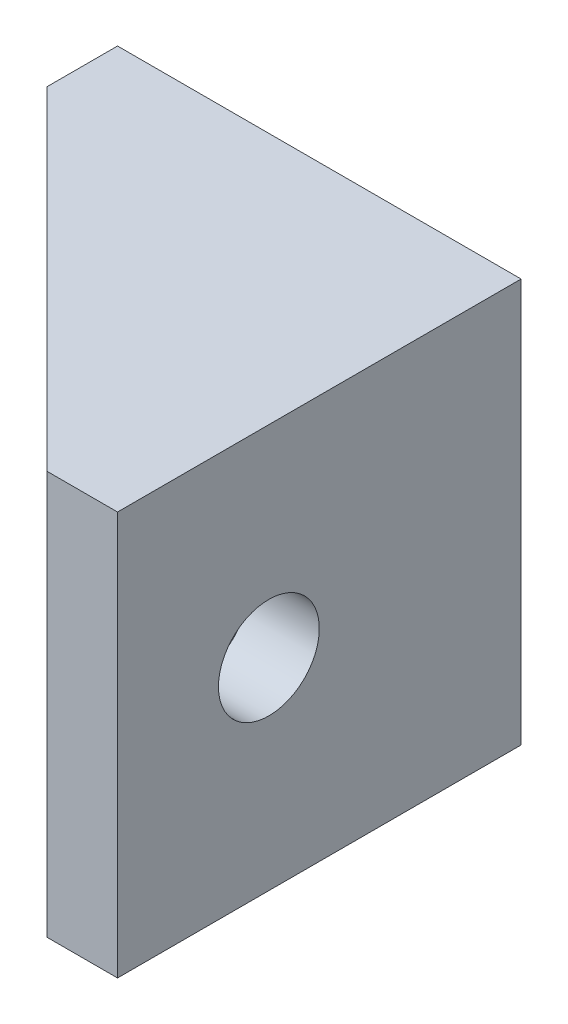
ISO-10303-21;
HEADER;
FILE_DESCRIPTION(('STEP AP214'),'2;1');
FILE_NAME('part.step','',(''),(''),'','','');
FILE_SCHEMA(('AUTOMOTIVE_DESIGN { 1 0 10303 214 1 1 1 1 }'));
ENDSEC;
DATA;
#1=APPLICATION_CONTEXT('core data for automotive mechanical design processes');
#2=APPLICATION_PROTOCOL_DEFINITION('international standard','automotive_design',2000,#1);
#3=PRODUCT_CONTEXT('',#1,'mechanical');
#4=PRODUCT('Part','Part','',(#3));
#5=PRODUCT_RELATED_PRODUCT_CATEGORY('part','',(#4));
#6=PRODUCT_DEFINITION_FORMATION('','',#4);
#7=PRODUCT_DEFINITION_CONTEXT('part definition',#1,'design');
#8=PRODUCT_DEFINITION('design','',#6,#7);
#9=PRODUCT_DEFINITION_SHAPE('','',#8);
#10=(LENGTH_UNIT() NAMED_UNIT(*) SI_UNIT(.MILLI.,.METRE.));
#11=(NAMED_UNIT(*) PLANE_ANGLE_UNIT() SI_UNIT($,.RADIAN.));
#12=(NAMED_UNIT(*) SI_UNIT($,.STERADIAN.) SOLID_ANGLE_UNIT());
#13=UNCERTAINTY_MEASURE_WITH_UNIT(LENGTH_MEASURE(1.E-05),#10,'distance_accuracy_value','');
#14=(GEOMETRIC_REPRESENTATION_CONTEXT(3) GLOBAL_UNCERTAINTY_ASSIGNED_CONTEXT((#13)) GLOBAL_UNIT_ASSIGNED_CONTEXT((#10,
#11,#12)) REPRESENTATION_CONTEXT('',''));
#15=CARTESIAN_POINT('',(0.,0.,0.));
#16=DIRECTION('',(0.,0.,1.));
#17=DIRECTION('',(1.,0.,0.));
#18=AXIS2_PLACEMENT_3D('',#15,#16,#17);
#19=CARTESIAN_POINT('',(-20.,20.,0.));
#20=DIRECTION('',(0.,0.,-1.));
#21=DIRECTION('',(-1.,0.,0.));
#22=AXIS2_PLACEMENT_3D('',#19,#20,#21);
#23=PLANE('',#22);
#24=DIRECTION('',(0.,1.,0.));
#25=VECTOR('',#24,1.);
#26=CARTESIAN_POINT('',(-3.5,-25.3012701892219,0.));
#27=LINE('',#26,#25);
#28=CARTESIAN_POINT('',(-3.50000000000001,0.,0.));
#29=VERTEX_POINT('',#28);
#30=CARTESIAN_POINT('',(-3.5,2.,0.));
#31=VERTEX_POINT('',#30);
#32=EDGE_CURVE('E133',#29,#31,#27,.T.);
#33=ORIENTED_EDGE('',*,*,#32,.F.);
#34=DIRECTION('',(1.,0.,0.));
#35=VECTOR('',#34,1.);
#36=CARTESIAN_POINT('',(-20.,0.,0.));
#37=LINE('',#36,#35);
#38=CARTESIAN_POINT('',(0.,0.,0.));
#39=VERTEX_POINT('',#38);
#40=EDGE_CURVE('E169',#29,#39,#37,.T.);
#41=ORIENTED_EDGE('',*,*,#40,.T.);
#42=DIRECTION('',(0.,-1.,0.));
#43=VECTOR('',#42,1.);
#44=CARTESIAN_POINT('',(0.,20.,0.));
#45=LINE('',#44,#43);
#46=CARTESIAN_POINT('',(0.,20.,0.));
#47=VERTEX_POINT('',#46);
#48=EDGE_CURVE('E46',#47,#39,#45,.T.);
#49=ORIENTED_EDGE('',*,*,#48,.F.);
#50=DIRECTION('',(1.,0.,0.));
#51=VECTOR('',#50,1.);
#52=CARTESIAN_POINT('',(-20.,20.,0.));
#53=LINE('',#52,#51);
#54=CARTESIAN_POINT('',(-3.5,20.,0.));
#55=VERTEX_POINT('',#54);
#56=EDGE_CURVE('E160',#55,#47,#53,.T.);
#57=ORIENTED_EDGE('',*,*,#56,.F.);
#58=CARTESIAN_POINT('',(-3.5,18.,0.));
#59=VERTEX_POINT('',#58);
#60=EDGE_CURVE('E129',#59,#55,#27,.T.);
#61=ORIENTED_EDGE('',*,*,#60,.F.);
#62=DIRECTION('',(0.,1.,0.));
#63=VECTOR('',#62,1.);
#64=CARTESIAN_POINT('',(-3.5,18.,0.));
#65=LINE('',#64,#63);
#66=EDGE_CURVE('E152',#31,#59,#65,.T.);
#67=ORIENTED_EDGE('',*,*,#66,.F.);
#68=EDGE_LOOP('',(#33,#41,#49,#57,#61,#67));
#69=FACE_BOUND('',#68,.T.);
#70=ADVANCED_FACE('F38',(#69),#23,.F.);
#71=CARTESIAN_POINT('',(0.,20.,0.));
#72=DIRECTION('',(0.,1.,0.));
#73=DIRECTION('',(0.,0.,1.));
#74=AXIS2_PLACEMENT_3D('',#71,#72,#73);
#75=PLANE('',#74);
#76=DIRECTION('',(0.,0.,1.));
#77=VECTOR('',#76,1.);
#78=CARTESIAN_POINT('',(-20.,20.,-20.));
#79=LINE('',#78,#77);
#80=CARTESIAN_POINT('',(-20.,20.,-20.));
#81=VERTEX_POINT('',#80);
#82=CARTESIAN_POINT('',(-20.,20.,-16.5));
#83=VERTEX_POINT('',#82);
#84=EDGE_CURVE('E158',#81,#83,#79,.T.);
#85=ORIENTED_EDGE('',*,*,#84,.T.);
#86=DIRECTION('',(0.707106781186548,0.,0.707106781186547));
#87=VECTOR('',#86,1.);
#88=CARTESIAN_POINT('',(-1.75,20.,1.75));
#89=LINE('',#88,#87);
#90=EDGE_CURVE('E53',#83,#55,#89,.T.);
#91=ORIENTED_EDGE('',*,*,#90,.T.);
#92=ORIENTED_EDGE('',*,*,#56,.T.);
#93=DIRECTION('',(0.,0.,-1.));
#94=VECTOR('',#93,1.);
#95=CARTESIAN_POINT('',(0.,20.,-20.));
#96=LINE('',#95,#94);
#97=CARTESIAN_POINT('',(0.,20.,-20.));
#98=VERTEX_POINT('',#97);
#99=EDGE_CURVE('E163',#47,#98,#96,.T.);
#100=ORIENTED_EDGE('',*,*,#99,.T.);
#101=DIRECTION('',(-1.,0.,0.));
#102=VECTOR('',#101,1.);
#103=CARTESIAN_POINT('',(-20.,20.,-20.));
#104=LINE('',#103,#102);
#105=EDGE_CURVE('E165',#98,#81,#104,.T.);
#106=ORIENTED_EDGE('',*,*,#105,.T.);
#107=EDGE_LOOP('',(#85,#91,#92,#100,#106));
#108=FACE_BOUND('',#107,.T.);
#109=ADVANCED_FACE('F191',(#108),#75,.T.);
#110=CARTESIAN_POINT('',(0.,0.,0.));
#111=DIRECTION('',(0.,1.,0.));
#112=DIRECTION('',(0.,0.,1.));
#113=AXIS2_PLACEMENT_3D('',#110,#111,#112);
#114=PLANE('',#113);
#115=DIRECTION('',(0.707106781186548,0.,0.707106781186547));
#116=VECTOR('',#115,1.);
#117=CARTESIAN_POINT('',(-1.75,0.,1.75));
#118=LINE('',#117,#116);
#119=CARTESIAN_POINT('',(-20.,0.,-16.5));
#120=VERTEX_POINT('',#119);
#121=EDGE_CURVE('E134',#120,#29,#118,.T.);
#122=ORIENTED_EDGE('',*,*,#121,.F.);
#123=DIRECTION('',(0.,0.,1.));
#124=VECTOR('',#123,1.);
#125=CARTESIAN_POINT('',(-20.,0.,-20.));
#126=LINE('',#125,#124);
#127=CARTESIAN_POINT('',(-20.,0.,-20.));
#128=VERTEX_POINT('',#127);
#129=EDGE_CURVE('E126',#128,#120,#126,.T.);
#130=ORIENTED_EDGE('',*,*,#129,.F.);
#131=DIRECTION('',(-1.,0.,0.));
#132=VECTOR('',#131,1.);
#133=CARTESIAN_POINT('',(-20.,0.,-20.));
#134=LINE('',#133,#132);
#135=CARTESIAN_POINT('',(0.,0.,-20.));
#136=VERTEX_POINT('',#135);
#137=EDGE_CURVE('E161',#136,#128,#134,.T.);
#138=ORIENTED_EDGE('',*,*,#137,.F.);
#139=DIRECTION('',(0.,0.,-1.));
#140=VECTOR('',#139,1.);
#141=CARTESIAN_POINT('',(0.,0.,-20.));
#142=LINE('',#141,#140);
#143=EDGE_CURVE('E171',#39,#136,#142,.T.);
#144=ORIENTED_EDGE('',*,*,#143,.F.);
#145=ORIENTED_EDGE('',*,*,#40,.F.);
#146=EDGE_LOOP('',(#122,#130,#138,#144,#145));
#147=FACE_BOUND('',#146,.T.);
#148=ADVANCED_FACE('F186',(#147),#114,.F.);
#149=CARTESIAN_POINT('',(-3.5,18.,-16.5));
#150=DIRECTION('',(0.,1.,0.));
#151=DIRECTION('',(0.,0.,1.));
#152=AXIS2_PLACEMENT_3D('',#149,#150,#151);
#153=PLANE('',#152);
#154=DIRECTION('',(0.707106781186548,0.,0.707106781186547));
#155=VECTOR('',#154,1.);
#156=CARTESIAN_POINT('',(-11.75,18.,-8.25));
#157=LINE('',#156,#155);
#158=CARTESIAN_POINT('',(-20.,18.,-16.5));
#159=VERTEX_POINT('',#158);
#160=EDGE_CURVE('E138',#159,#59,#157,.T.);
#161=ORIENTED_EDGE('',*,*,#160,.F.);
#162=DIRECTION('',(-1.,0.,0.));
#163=VECTOR('',#162,1.);
#164=CARTESIAN_POINT('',(-3.5,18.,-16.5));
#165=LINE('',#164,#163);
#166=CARTESIAN_POINT('',(-3.5,18.,-16.5));
#167=VERTEX_POINT('',#166);
#168=EDGE_CURVE('E110',#167,#159,#165,.T.);
#169=ORIENTED_EDGE('',*,*,#168,.F.);
#170=DIRECTION('',(0.,0.,-1.));
#171=VECTOR('',#170,1.);
#172=CARTESIAN_POINT('',(-3.5,18.,-16.5));
#173=LINE('',#172,#171);
#174=EDGE_CURVE('E119',#59,#167,#173,.T.);
#175=ORIENTED_EDGE('',*,*,#174,.F.);
#176=EDGE_LOOP('',(#161,#169,#175));
#177=FACE_BOUND('',#176,.T.);
#178=ADVANCED_FACE('F198',(#177),#153,.F.);
#179=CARTESIAN_POINT('',(-3.5,2.,-16.5));
#180=DIRECTION('',(0.,-1.,0.));
#181=DIRECTION('',(0.,0.,-1.));
#182=AXIS2_PLACEMENT_3D('',#179,#180,#181);
#183=PLANE('',#182);
#184=DIRECTION('',(-0.707106781186548,0.,-0.707106781186547));
#185=VECTOR('',#184,1.);
#186=CARTESIAN_POINT('',(-11.75,2.,-8.25));
#187=LINE('',#186,#185);
#188=CARTESIAN_POINT('',(-20.,2.,-16.5));
#189=VERTEX_POINT('',#188);
#190=EDGE_CURVE('E11',#31,#189,#187,.T.);
#191=ORIENTED_EDGE('',*,*,#190,.F.);
#192=DIRECTION('',(0.,0.,1.));
#193=VECTOR('',#192,1.);
#194=CARTESIAN_POINT('',(-3.5,2.,-16.5));
#195=LINE('',#194,#193);
#196=CARTESIAN_POINT('',(-3.5,2.,-16.5));
#197=VERTEX_POINT('',#196);
#198=EDGE_CURVE('E117',#197,#31,#195,.T.);
#199=ORIENTED_EDGE('',*,*,#198,.F.);
#200=DIRECTION('',(-1.,0.,0.));
#201=VECTOR('',#200,1.);
#202=CARTESIAN_POINT('',(-3.5,2.,-16.5));
#203=LINE('',#202,#201);
#204=EDGE_CURVE('E108',#197,#189,#203,.T.);
#205=ORIENTED_EDGE('',*,*,#204,.T.);
#206=EDGE_LOOP('',(#191,#199,#205));
#207=FACE_BOUND('',#206,.T.);
#208=ADVANCED_FACE('F115',(#207),#183,.F.);
#209=CARTESIAN_POINT('',(-20.,20.,-20.));
#210=DIRECTION('',(1.,0.,0.));
#211=DIRECTION('',(0.,0.,-1.));
#212=AXIS2_PLACEMENT_3D('',#209,#210,#211);
#213=PLANE('',#212);
#214=ORIENTED_EDGE('',*,*,#129,.T.);
#215=DIRECTION('',(0.,1.,0.));
#216=VECTOR('',#215,1.);
#217=CARTESIAN_POINT('',(-20.,-25.3012701892219,-16.5));
#218=LINE('',#217,#216);
#219=EDGE_CURVE('E123',#120,#189,#218,.T.);
#220=ORIENTED_EDGE('',*,*,#219,.T.);
#221=DIRECTION('',(0.,-1.,0.));
#222=VECTOR('',#221,1.);
#223=CARTESIAN_POINT('',(-20.,18.,-16.5));
#224=LINE('',#223,#222);
#225=EDGE_CURVE('E104',#159,#189,#224,.T.);
#226=ORIENTED_EDGE('',*,*,#225,.F.);
#227=EDGE_CURVE('E61',#159,#83,#218,.T.);
#228=ORIENTED_EDGE('',*,*,#227,.T.);
#229=ORIENTED_EDGE('',*,*,#84,.F.);
#230=DIRECTION('',(0.,-1.,0.));
#231=VECTOR('',#230,1.);
#232=CARTESIAN_POINT('',(-20.,20.,-20.));
#233=LINE('',#232,#231);
#234=EDGE_CURVE('E167',#81,#128,#233,.T.);
#235=ORIENTED_EDGE('',*,*,#234,.T.);
#236=EDGE_LOOP('',(#214,#220,#226,#228,#229,#235));
#237=FACE_BOUND('',#236,.T.);
#238=ADVANCED_FACE('F40',(#237),#213,.F.);
#239=CARTESIAN_POINT('',(0.,20.,-20.));
#240=DIRECTION('',(-1.,0.,0.));
#241=DIRECTION('',(0.,0.,1.));
#242=AXIS2_PLACEMENT_3D('',#239,#240,#241);
#243=PLANE('',#242);
#244=CARTESIAN_POINT('',(0.,10.,-7.5));
#245=DIRECTION('',(-1.,0.,0.));
#246=DIRECTION('',(0.,0.,1.));
#247=AXIS2_PLACEMENT_3D('',#244,#245,#246);
#248=CIRCLE('',#247,2.5);
#249=CARTESIAN_POINT('',(0.,10.,-5.));
#250=VERTEX_POINT('',#249);
#251=EDGE_CURVE('E146',#250,#250,#248,.T.);
#252=ORIENTED_EDGE('',*,*,#251,.T.);
#253=EDGE_LOOP('',(#252));
#254=FACE_BOUND('',#253,.T.);
#255=ORIENTED_EDGE('',*,*,#143,.T.);
#256=DIRECTION('',(0.,-1.,0.));
#257=VECTOR('',#256,1.);
#258=CARTESIAN_POINT('',(0.,20.,-20.));
#259=LINE('',#258,#257);
#260=EDGE_CURVE('E175',#98,#136,#259,.T.);
#261=ORIENTED_EDGE('',*,*,#260,.F.);
#262=ORIENTED_EDGE('',*,*,#99,.F.);
#263=ORIENTED_EDGE('',*,*,#48,.T.);
#264=EDGE_LOOP('',(#255,#261,#262,#263));
#265=FACE_BOUND('',#264,.T.);
#266=ADVANCED_FACE('F182',(#254,#265),#243,.F.);
#267=CARTESIAN_POINT('',(-20.,20.,-20.));
#268=DIRECTION('',(0.,0.,1.));
#269=DIRECTION('',(1.,0.,0.));
#270=AXIS2_PLACEMENT_3D('',#267,#268,#269);
#271=PLANE('',#270);
#272=CARTESIAN_POINT('',(-12.5,10.,-20.));
#273=DIRECTION('',(0.,0.,1.));
#274=DIRECTION('',(1.,0.,0.));
#275=AXIS2_PLACEMENT_3D('',#272,#273,#274);
#276=CIRCLE('',#275,2.5);
#277=CARTESIAN_POINT('',(-10.,10.,-20.));
#278=VERTEX_POINT('',#277);
#279=EDGE_CURVE('E230',#278,#278,#276,.T.);
#280=ORIENTED_EDGE('',*,*,#279,.T.);
#281=EDGE_LOOP('',(#280));
#282=FACE_BOUND('',#281,.T.);
#283=ORIENTED_EDGE('',*,*,#137,.T.);
#284=ORIENTED_EDGE('',*,*,#234,.F.);
#285=ORIENTED_EDGE('',*,*,#105,.F.);
#286=ORIENTED_EDGE('',*,*,#260,.T.);
#287=EDGE_LOOP('',(#283,#284,#285,#286));
#288=FACE_BOUND('',#287,.T.);
#289=ADVANCED_FACE('F189',(#282,#288),#271,.F.);
#290=CARTESIAN_POINT('',(-3.5,18.,-16.5));
#291=DIRECTION('',(0.,0.,-1.));
#292=DIRECTION('',(0.,1.,0.));
#293=AXIS2_PLACEMENT_3D('',#290,#291,#292);
#294=PLANE('',#293);
#295=CARTESIAN_POINT('',(-12.5,10.,-16.5));
#296=DIRECTION('',(0.,0.,1.));
#297=DIRECTION('',(1.,0.,0.));
#298=AXIS2_PLACEMENT_3D('',#295,#296,#297);
#299=CIRCLE('',#298,2.5);
#300=CARTESIAN_POINT('',(-10.,10.,-16.5));
#301=VERTEX_POINT('',#300);
#302=EDGE_CURVE('E228',#301,#301,#299,.T.);
#303=ORIENTED_EDGE('',*,*,#302,.F.);
#304=EDGE_LOOP('',(#303));
#305=FACE_BOUND('',#304,.T.);
#306=ORIENTED_EDGE('',*,*,#225,.T.);
#307=ORIENTED_EDGE('',*,*,#204,.F.);
#308=DIRECTION('',(0.,-1.,0.));
#309=VECTOR('',#308,1.);
#310=CARTESIAN_POINT('',(-3.5,18.,-16.5));
#311=LINE('',#310,#309);
#312=EDGE_CURVE('E112',#167,#197,#311,.T.);
#313=ORIENTED_EDGE('',*,*,#312,.F.);
#314=ORIENTED_EDGE('',*,*,#168,.T.);
#315=EDGE_LOOP('',(#306,#307,#313,#314));
#316=FACE_BOUND('',#315,.T.);
#317=ADVANCED_FACE('F106',(#305,#316),#294,.F.);
#318=CARTESIAN_POINT('',(-3.5,0.,0.));
#319=DIRECTION('',(-1.,0.,0.));
#320=DIRECTION('',(0.,0.,1.));
#321=AXIS2_PLACEMENT_3D('',#318,#319,#320);
#322=PLANE('',#321);
#323=CARTESIAN_POINT('',(-3.5,10.,-7.5));
#324=DIRECTION('',(-1.,0.,0.));
#325=DIRECTION('',(0.,0.,1.));
#326=AXIS2_PLACEMENT_3D('',#323,#324,#325);
#327=CIRCLE('',#326,2.5);
#328=CARTESIAN_POINT('',(-3.5,10.,-5.));
#329=VERTEX_POINT('',#328);
#330=EDGE_CURVE('E144',#329,#329,#327,.T.);
#331=ORIENTED_EDGE('',*,*,#330,.F.);
#332=EDGE_LOOP('',(#331));
#333=FACE_BOUND('',#332,.T.);
#334=ORIENTED_EDGE('',*,*,#312,.T.);
#335=ORIENTED_EDGE('',*,*,#198,.T.);
#336=ORIENTED_EDGE('',*,*,#66,.T.);
#337=ORIENTED_EDGE('',*,*,#174,.T.);
#338=EDGE_LOOP('',(#334,#335,#336,#337));
#339=FACE_BOUND('',#338,.T.);
#340=ADVANCED_FACE('F196',(#333,#339),#322,.T.);
#341=CARTESIAN_POINT('',(-20.,-25.3012701892219,-16.5));
#342=DIRECTION('',(-0.707106781186547,0.,0.707106781186548));
#343=DIRECTION('',(0.707106781186548,0.,0.707106781186547));
#344=AXIS2_PLACEMENT_3D('',#341,#342,#343);
#345=PLANE('',#344);
#346=ORIENTED_EDGE('',*,*,#219,.F.);
#347=ORIENTED_EDGE('',*,*,#121,.T.);
#348=ORIENTED_EDGE('',*,*,#32,.T.);
#349=ORIENTED_EDGE('',*,*,#190,.T.);
#350=EDGE_LOOP('',(#346,#347,#348,#349));
#351=FACE_BOUND('',#350,.T.);
#352=ADVANCED_FACE('F132',(#351),#345,.T.);
#353=ORIENTED_EDGE('',*,*,#90,.F.);
#354=ORIENTED_EDGE('',*,*,#227,.F.);
#355=ORIENTED_EDGE('',*,*,#160,.T.);
#356=ORIENTED_EDGE('',*,*,#60,.T.);
#357=EDGE_LOOP('',(#353,#354,#355,#356));
#358=FACE_BOUND('',#357,.T.);
#359=ADVANCED_FACE('F193',(#358),#345,.T.);
#360=CARTESIAN_POINT('',(0.,10.,-7.5));
#361=DIRECTION('',(-1.,0.,0.));
#362=DIRECTION('',(0.,0.,1.));
#363=AXIS2_PLACEMENT_3D('',#360,#361,#362);
#364=CYLINDRICAL_SURFACE('',#363,2.5);
#365=ORIENTED_EDGE('',*,*,#251,.F.);
#366=EDGE_LOOP('',(#365));
#367=FACE_BOUND('',#366,.T.);
#368=ORIENTED_EDGE('',*,*,#330,.T.);
#369=EDGE_LOOP('',(#368));
#370=FACE_BOUND('',#369,.T.);
#371=ADVANCED_FACE('F239',(#367,#370),#364,.F.);
#372=CARTESIAN_POINT('',(-12.5,10.,-20.));
#373=DIRECTION('',(0.,0.,1.));
#374=DIRECTION('',(1.,0.,0.));
#375=AXIS2_PLACEMENT_3D('',#372,#373,#374);
#376=CYLINDRICAL_SURFACE('',#375,2.5);
#377=CARTESIAN_POINT('',(-10.,10.,-20.));
#378=CARTESIAN_POINT('',(-10.,10.,-19.9635416666667));
#379=CARTESIAN_POINT('',(-10.,10.,-19.9270833333333));
#380=CARTESIAN_POINT('',(-10.,10.,-19.8541666666667));
#381=CARTESIAN_POINT('',(-10.,10.,-19.8177083333333));
#382=CARTESIAN_POINT('',(-10.,10.,-19.7447916666667));
#383=CARTESIAN_POINT('',(-10.,10.,-19.7083333333333));
#384=CARTESIAN_POINT('',(-10.,10.,-19.6354166666667));
#385=CARTESIAN_POINT('',(-10.,10.,-19.5989583333333));
#386=CARTESIAN_POINT('',(-10.,10.,-19.5260416666667));
#387=CARTESIAN_POINT('',(-10.,10.,-19.4895833333333));
#388=CARTESIAN_POINT('',(-10.,10.,-19.4166666666667));
#389=CARTESIAN_POINT('',(-10.,10.,-19.3802083333333));
#390=CARTESIAN_POINT('',(-10.,10.,-19.3072916666667));
#391=CARTESIAN_POINT('',(-10.,10.,-19.2708333333333));
#392=CARTESIAN_POINT('',(-10.,10.,-19.1979166666667));
#393=CARTESIAN_POINT('',(-10.,10.,-19.1614583333333));
#394=CARTESIAN_POINT('',(-10.,10.,-19.0885416666667));
#395=CARTESIAN_POINT('',(-10.,10.,-19.0520833333333));
#396=CARTESIAN_POINT('',(-10.,10.,-18.9791666666667));
#397=CARTESIAN_POINT('',(-10.,10.,-18.9427083333333));
#398=CARTESIAN_POINT('',(-10.,10.,-18.8697916666667));
#399=CARTESIAN_POINT('',(-10.,10.,-18.8333333333333));
#400=CARTESIAN_POINT('',(-10.,10.,-18.7604166666667));
#401=CARTESIAN_POINT('',(-10.,10.,-18.7239583333333));
#402=CARTESIAN_POINT('',(-10.,10.,-18.6510416666667));
#403=CARTESIAN_POINT('',(-10.,10.,-18.6145833333333));
#404=CARTESIAN_POINT('',(-10.,10.,-18.5416666666667));
#405=CARTESIAN_POINT('',(-10.,10.,-18.5052083333333));
#406=CARTESIAN_POINT('',(-10.,10.,-18.4322916666667));
#407=CARTESIAN_POINT('',(-10.,10.,-18.3958333333333));
#408=CARTESIAN_POINT('',(-10.,10.,-18.3229166666667));
#409=CARTESIAN_POINT('',(-10.,10.,-18.2864583333333));
#410=CARTESIAN_POINT('',(-10.,10.,-18.2135416666667));
#411=CARTESIAN_POINT('',(-10.,10.,-18.1770833333333));
#412=CARTESIAN_POINT('',(-10.,10.,-18.1041666666667));
#413=CARTESIAN_POINT('',(-10.,10.,-18.0677083333333));
#414=CARTESIAN_POINT('',(-10.,10.,-17.9947916666667));
#415=CARTESIAN_POINT('',(-10.,10.,-17.9583333333333));
#416=CARTESIAN_POINT('',(-10.,10.,-17.8854166666667));
#417=CARTESIAN_POINT('',(-10.,10.,-17.8489583333333));
#418=CARTESIAN_POINT('',(-10.,10.,-17.7760416666667));
#419=CARTESIAN_POINT('',(-10.,10.,-17.7395833333333));
#420=CARTESIAN_POINT('',(-10.,10.,-17.6666666666667));
#421=CARTESIAN_POINT('',(-10.,10.,-17.6302083333333));
#422=CARTESIAN_POINT('',(-10.,10.,-17.5572916666667));
#423=CARTESIAN_POINT('',(-10.,10.,-17.5208333333333));
#424=CARTESIAN_POINT('',(-10.,10.,-17.4479166666667));
#425=CARTESIAN_POINT('',(-10.,10.,-17.4114583333333));
#426=CARTESIAN_POINT('',(-10.,10.,-17.3385416666667));
#427=CARTESIAN_POINT('',(-10.,10.,-17.3020833333333));
#428=CARTESIAN_POINT('',(-10.,10.,-17.2291666666667));
#429=CARTESIAN_POINT('',(-10.,10.,-17.1927083333333));
#430=CARTESIAN_POINT('',(-10.,10.,-17.1197916666667));
#431=CARTESIAN_POINT('',(-10.,10.,-17.0833333333333));
#432=CARTESIAN_POINT('',(-10.,10.,-17.0104166666667));
#433=CARTESIAN_POINT('',(-10.,10.,-16.9739583333333));
#434=CARTESIAN_POINT('',(-10.,10.,-16.9010416666667));
#435=CARTESIAN_POINT('',(-10.,10.,-16.8645833333333));
#436=CARTESIAN_POINT('',(-10.,10.,-16.7916666666667));
#437=CARTESIAN_POINT('',(-10.,10.,-16.7552083333333));
#438=CARTESIAN_POINT('',(-10.,10.,-16.6822916666667));
#439=CARTESIAN_POINT('',(-10.,10.,-16.6458333333333));
#440=CARTESIAN_POINT('',(-10.,10.,-16.5729166666667));
#441=CARTESIAN_POINT('',(-10.,10.,-16.5364583333333));
#442=CARTESIAN_POINT('',(-10.,10.,-16.5));
#443=B_SPLINE_CURVE_WITH_KNOTS('',3,(#377,#378,#379,#380,#381,#382,#383,#384,#385,#386,#387,
#388,#389,#390,#391,#392,#393,#394,#395,#396,#397,#398,#399,#400,#401,#402,#403,#404,#405,#406,
#407,#408,#409,#410,#411,#412,#413,#414,#415,#416,#417,#418,#419,#420,#421,#422,#423,#424,#425,
#426,#427,#428,#429,#430,#431,#432,#433,#434,#435,#436,#437,#438,#439,#440,#441,#442),
.UNSPECIFIED.,.F.,.F.,(4,2,2,2,2,2,2,2,2,2,2,2,2,2,2,2,2,2,2,2,2,2,2,2,2,2,2,2,2,2,2,2,4),(0.,
0.109374999999998,0.218749999999997,0.328124999999999,0.437499999999997,0.546874999999999,
0.656249999999997,0.765624999999999,0.874999999999997,0.984374999999999,1.09375,1.203125,1.3125,
1.421875,1.53125,1.640625,1.75,1.859375,1.96875,2.078125,2.1875,2.296875,2.40625,2.515625,2.625,
2.734375,2.84375,2.953125,3.0625,3.171875,3.28125,3.390625,3.5),.UNSPECIFIED.);
#444=EDGE_CURVE('BSEAM241',#278,#301,#443,.T.);
#445=ORIENTED_EDGE('',*,*,#279,.F.);
#446=ORIENTED_EDGE('',*,*,#302,.T.);
#447=ORIENTED_EDGE('',*,*,#444,.T.);
#448=ORIENTED_EDGE('',*,*,#444,.F.);
#449=EDGE_LOOP('',(#445,#447,#446,#448));
#450=FACE_BOUND('',#449,.T.);
#451=ADVANCED_FACE('F241',(#450),#376,.F.);
#452=CLOSED_SHELL('',(#70,#109,#148,#178,#208,#238,#266,#289,#317,#340,#352,#359,#371,#451));
#453=MANIFOLD_SOLID_BREP('B2',#452);
#454=ADVANCED_BREP_SHAPE_REPRESENTATION('',(#18,#453),#14);
#455=SHAPE_DEFINITION_REPRESENTATION(#9,#454);
ENDSEC;
END-ISO-10303-21;
